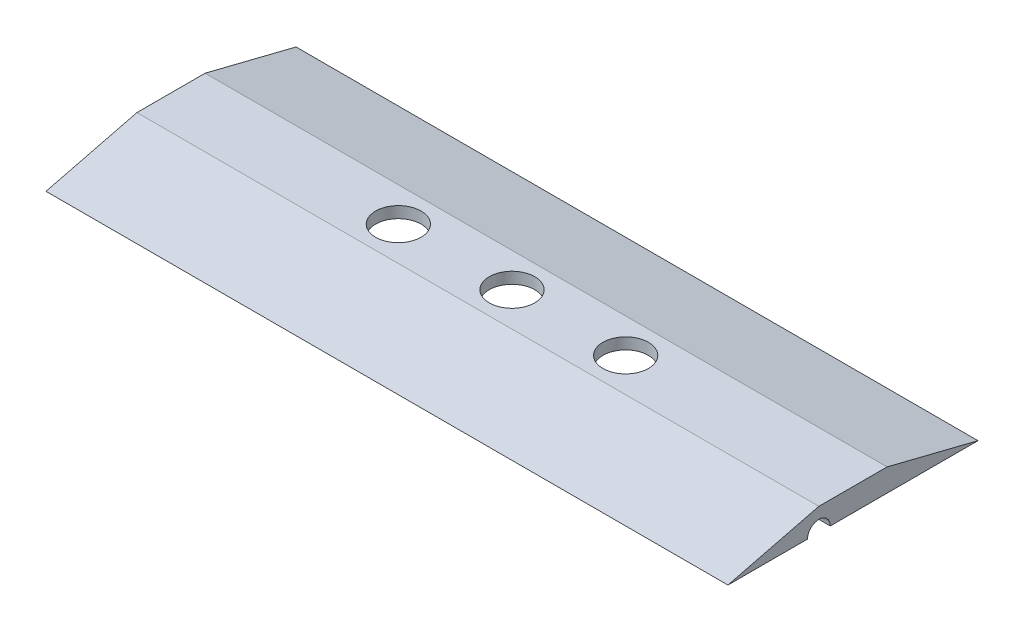
ISO-10303-21;
HEADER;
FILE_DESCRIPTION(('STEP AP214'),'2;1');
FILE_NAME('part.step','',(''),(''),'','','');
FILE_SCHEMA(('AUTOMOTIVE_DESIGN { 1 0 10303 214 1 1 1 1 }'));
ENDSEC;
DATA;
#1=APPLICATION_CONTEXT('core data for automotive mechanical design processes');
#2=APPLICATION_PROTOCOL_DEFINITION('international standard','automotive_design',2000,#1);
#3=PRODUCT_CONTEXT('',#1,'mechanical');
#4=PRODUCT('Part','Part','',(#3));
#5=PRODUCT_RELATED_PRODUCT_CATEGORY('part','',(#4));
#6=PRODUCT_DEFINITION_FORMATION('','',#4);
#7=PRODUCT_DEFINITION_CONTEXT('part definition',#1,'design');
#8=PRODUCT_DEFINITION('design','',#6,#7);
#9=PRODUCT_DEFINITION_SHAPE('','',#8);
#10=(LENGTH_UNIT() NAMED_UNIT(*) SI_UNIT(.MILLI.,.METRE.));
#11=(NAMED_UNIT(*) PLANE_ANGLE_UNIT() SI_UNIT($,.RADIAN.));
#12=(NAMED_UNIT(*) SI_UNIT($,.STERADIAN.) SOLID_ANGLE_UNIT());
#13=UNCERTAINTY_MEASURE_WITH_UNIT(LENGTH_MEASURE(1.E-05),#10,'distance_accuracy_value','');
#14=(GEOMETRIC_REPRESENTATION_CONTEXT(3) GLOBAL_UNCERTAINTY_ASSIGNED_CONTEXT((#13)) GLOBAL_UNIT_ASSIGNED_CONTEXT((#10,
#11,#12)) REPRESENTATION_CONTEXT('',''));
#15=CARTESIAN_POINT('',(0.,0.,0.));
#16=DIRECTION('',(0.,0.,1.));
#17=DIRECTION('',(1.,0.,0.));
#18=AXIS2_PLACEMENT_3D('',#15,#16,#17);
#19=CARTESIAN_POINT('',(0.,0.,0.));
#20=DIRECTION('',(0.,1.,0.));
#21=DIRECTION('',(0.,0.,1.));
#22=AXIS2_PLACEMENT_3D('',#19,#20,#21);
#23=CYLINDRICAL_SURFACE('',#22,10.);
#24=CARTESIAN_POINT('',(0.,10.,0.));
#25=DIRECTION('',(0.,1.,0.));
#26=DIRECTION('',(0.,0.,1.));
#27=AXIS2_PLACEMENT_3D('',#24,#25,#26);
#28=CIRCLE('',#27,10.);
#29=CARTESIAN_POINT('',(0.,10.,10.));
#30=VERTEX_POINT('',#29);
#31=EDGE_CURVE('E177',#30,#30,#28,.T.);
#32=ORIENTED_EDGE('',*,*,#31,.T.);
#33=EDGE_LOOP('',(#32));
#34=FACE_BOUND('',#33,.T.);
#35=CARTESIAN_POINT('',(0.,5.,0.));
#36=DIRECTION('',(0.,-1.,0.));
#37=DIRECTION('',(0.,0.,-1.));
#38=AXIS2_PLACEMENT_3D('',#35,#36,#37);
#39=CIRCLE('',#38,10.);
#40=CARTESIAN_POINT('',(0.,5.,-10.));
#41=VERTEX_POINT('',#40);
#42=EDGE_CURVE('E168',#41,#41,#39,.F.);
#43=ORIENTED_EDGE('',*,*,#42,.F.);
#44=EDGE_LOOP('',(#43));
#45=FACE_BOUND('',#44,.T.);
#46=ADVANCED_FACE('F41',(#34,#45),#23,.F.);
#47=CARTESIAN_POINT('',(50.,0.,0.));
#48=DIRECTION('',(0.,1.,0.));
#49=DIRECTION('',(0.,0.,1.));
#50=AXIS2_PLACEMENT_3D('',#47,#48,#49);
#51=CYLINDRICAL_SURFACE('',#50,10.);
#52=CARTESIAN_POINT('',(50.,10.,0.));
#53=DIRECTION('',(0.,1.,0.));
#54=DIRECTION('',(0.,0.,1.));
#55=AXIS2_PLACEMENT_3D('',#52,#53,#54);
#56=CIRCLE('',#55,10.);
#57=CARTESIAN_POINT('',(50.,10.,10.));
#58=VERTEX_POINT('',#57);
#59=EDGE_CURVE('E173',#58,#58,#56,.T.);
#60=ORIENTED_EDGE('',*,*,#59,.T.);
#61=EDGE_LOOP('',(#60));
#62=FACE_BOUND('',#61,.T.);
#63=CARTESIAN_POINT('',(50.,5.,0.));
#64=DIRECTION('',(0.,-1.,0.));
#65=DIRECTION('',(0.,0.,-1.));
#66=AXIS2_PLACEMENT_3D('',#63,#64,#65);
#67=CIRCLE('',#66,10.);
#68=CARTESIAN_POINT('',(50.,5.,-10.));
#69=VERTEX_POINT('',#68);
#70=EDGE_CURVE('E164',#69,#69,#67,.F.);
#71=ORIENTED_EDGE('',*,*,#70,.F.);
#72=EDGE_LOOP('',(#71));
#73=FACE_BOUND('',#72,.T.);
#74=ADVANCED_FACE('F294',(#62,#73),#51,.F.);
#75=CARTESIAN_POINT('',(-50.,0.,0.));
#76=DIRECTION('',(0.,1.,0.));
#77=DIRECTION('',(0.,0.,1.));
#78=AXIS2_PLACEMENT_3D('',#75,#76,#77);
#79=CYLINDRICAL_SURFACE('',#78,10.);
#80=CARTESIAN_POINT('',(-50.,10.,0.));
#81=DIRECTION('',(0.,1.,0.));
#82=DIRECTION('',(0.,0.,-1.));
#83=AXIS2_PLACEMENT_3D('',#80,#81,#82);
#84=CIRCLE('',#83,10.);
#85=CARTESIAN_POINT('',(-50.,10.,-10.));
#86=VERTEX_POINT('',#85);
#87=EDGE_CURVE('E172',#86,#86,#84,.T.);
#88=ORIENTED_EDGE('',*,*,#87,.T.);
#89=EDGE_LOOP('',(#88));
#90=FACE_BOUND('',#89,.T.);
#91=CARTESIAN_POINT('',(-50.,5.,0.));
#92=DIRECTION('',(0.,-1.,0.));
#93=DIRECTION('',(0.,0.,-1.));
#94=AXIS2_PLACEMENT_3D('',#91,#92,#93);
#95=CIRCLE('',#94,10.);
#96=CARTESIAN_POINT('',(-50.,5.,-10.));
#97=VERTEX_POINT('',#96);
#98=EDGE_CURVE('E162',#97,#97,#95,.F.);
#99=ORIENTED_EDGE('',*,*,#98,.F.);
#100=EDGE_LOOP('',(#99));
#101=FACE_BOUND('',#100,.T.);
#102=ADVANCED_FACE('F291',(#90,#101),#79,.F.);
#103=CARTESIAN_POINT('',(150.,0.,-15.));
#104=DIRECTION('',(0.,1.,0.));
#105=DIRECTION('',(0.,0.,1.));
#106=AXIS2_PLACEMENT_3D('',#103,#104,#105);
#107=PLANE('',#106);
#108=DIRECTION('',(1.,0.,0.));
#109=VECTOR('',#108,1.);
#110=CARTESIAN_POINT('',(-75.,0.,-15.));
#111=LINE('',#110,#109);
#112=CARTESIAN_POINT('',(-75.,0.,-15.));
#113=VERTEX_POINT('',#112);
#114=CARTESIAN_POINT('',(75.,0.,-15.));
#115=VERTEX_POINT('',#114);
#116=EDGE_CURVE('E146',#113,#115,#111,.T.);
#117=ORIENTED_EDGE('',*,*,#116,.F.);
#118=DIRECTION('',(0.,0.,-1.));
#119=VECTOR('',#118,1.);
#120=CARTESIAN_POINT('',(-75.,0.,15.));
#121=LINE('',#120,#119);
#122=CARTESIAN_POINT('',(-75.,0.,10.));
#123=VERTEX_POINT('',#122);
#124=EDGE_CURVE('E127',#123,#113,#121,.T.);
#125=ORIENTED_EDGE('',*,*,#124,.F.);
#126=DIRECTION('',(-1.,0.,0.));
#127=VECTOR('',#126,1.);
#128=CARTESIAN_POINT('',(150.,0.,10.));
#129=LINE('',#128,#127);
#130=CARTESIAN_POINT('',(-150.,0.,10.));
#131=VERTEX_POINT('',#130);
#132=EDGE_CURVE('E193',#123,#131,#129,.T.);
#133=ORIENTED_EDGE('',*,*,#132,.T.);
#134=DIRECTION('',(0.,0.,-1.));
#135=VECTOR('',#134,1.);
#136=CARTESIAN_POINT('',(-150.,0.,-15.));
#137=LINE('',#136,#135);
#138=CARTESIAN_POINT('',(-150.,0.,-55.));
#139=VERTEX_POINT('',#138);
#140=EDGE_CURVE('E219',#131,#139,#137,.T.);
#141=ORIENTED_EDGE('',*,*,#140,.T.);
#142=DIRECTION('',(-1.,0.,0.));
#143=VECTOR('',#142,1.);
#144=CARTESIAN_POINT('',(150.,0.,-55.));
#145=LINE('',#144,#143);
#146=CARTESIAN_POINT('',(150.,0.,-55.));
#147=VERTEX_POINT('',#146);
#148=EDGE_CURVE('E236',#147,#139,#145,.T.);
#149=ORIENTED_EDGE('',*,*,#148,.F.);
#150=DIRECTION('',(0.,0.,-1.));
#151=VECTOR('',#150,1.);
#152=CARTESIAN_POINT('',(150.,0.,15.));
#153=LINE('',#152,#151);
#154=CARTESIAN_POINT('',(150.,0.,10.));
#155=VERTEX_POINT('',#154);
#156=EDGE_CURVE('E203',#155,#147,#153,.T.);
#157=ORIENTED_EDGE('',*,*,#156,.F.);
#158=CARTESIAN_POINT('',(75.,0.,10.));
#159=VERTEX_POINT('',#158);
#160=EDGE_CURVE('E194',#155,#159,#129,.T.);
#161=ORIENTED_EDGE('',*,*,#160,.T.);
#162=DIRECTION('',(0.,0.,1.));
#163=VECTOR('',#162,1.);
#164=CARTESIAN_POINT('',(75.,0.,15.));
#165=LINE('',#164,#163);
#166=EDGE_CURVE('E143',#115,#159,#165,.T.);
#167=ORIENTED_EDGE('',*,*,#166,.F.);
#168=EDGE_LOOP('',(#117,#125,#133,#141,#149,#157,#161,#167));
#169=FACE_BOUND('',#168,.T.);
#170=ADVANCED_FACE('F254',(#169),#107,.F.);
#171=CARTESIAN_POINT('',(150.,0.,55.));
#172=DIRECTION('',(0.,-0.970142500145332,-0.242535625036333));
#173=DIRECTION('',(0.,0.242535625036333,-0.970142500145332));
#174=AXIS2_PLACEMENT_3D('',#171,#172,#173);
#175=PLANE('',#174);
#176=DIRECTION('',(0.,-0.242535625036333,0.970142500145332));
#177=VECTOR('',#176,1.);
#178=CARTESIAN_POINT('',(-150.,0.,55.));
#179=LINE('',#178,#177);
#180=CARTESIAN_POINT('',(-150.,10.,15.));
#181=VERTEX_POINT('',#180);
#182=CARTESIAN_POINT('',(-150.,0.,55.));
#183=VERTEX_POINT('',#182);
#184=EDGE_CURVE('E198',#181,#183,#179,.T.);
#185=ORIENTED_EDGE('',*,*,#184,.T.);
#186=DIRECTION('',(-1.,0.,0.));
#187=VECTOR('',#186,1.);
#188=CARTESIAN_POINT('',(150.,0.,55.));
#189=LINE('',#188,#187);
#190=CARTESIAN_POINT('',(150.,0.,55.));
#191=VERTEX_POINT('',#190);
#192=EDGE_CURVE('E240',#191,#183,#189,.T.);
#193=ORIENTED_EDGE('',*,*,#192,.F.);
#194=DIRECTION('',(0.,-0.242535625036333,0.970142500145332));
#195=VECTOR('',#194,1.);
#196=CARTESIAN_POINT('',(150.,0.,55.));
#197=LINE('',#196,#195);
#198=CARTESIAN_POINT('',(150.,10.,15.));
#199=VERTEX_POINT('',#198);
#200=EDGE_CURVE('E199',#199,#191,#197,.T.);
#201=ORIENTED_EDGE('',*,*,#200,.F.);
#202=DIRECTION('',(-1.,0.,0.));
#203=VECTOR('',#202,1.);
#204=CARTESIAN_POINT('',(150.,10.,15.));
#205=LINE('',#204,#203);
#206=EDGE_CURVE('E215',#199,#181,#205,.T.);
#207=ORIENTED_EDGE('',*,*,#206,.T.);
#208=EDGE_LOOP('',(#185,#193,#201,#207));
#209=FACE_BOUND('',#208,.T.);
#210=ADVANCED_FACE('F43',(#209),#175,.F.);
#211=CARTESIAN_POINT('',(-150.,0.,20.));
#212=VERTEX_POINT('',#211);
#213=EDGE_CURVE('E220',#183,#212,#137,.T.);
#214=ORIENTED_EDGE('',*,*,#213,.T.);
#215=DIRECTION('',(-1.,0.,0.));
#216=VECTOR('',#215,1.);
#217=CARTESIAN_POINT('',(150.,0.,20.));
#218=LINE('',#217,#216);
#219=CARTESIAN_POINT('',(150.,0.,20.));
#220=VERTEX_POINT('',#219);
#221=EDGE_CURVE('E65',#212,#220,#218,.F.);
#222=ORIENTED_EDGE('',*,*,#221,.T.);
#223=EDGE_CURVE('E205',#191,#220,#153,.T.);
#224=ORIENTED_EDGE('',*,*,#223,.F.);
#225=ORIENTED_EDGE('',*,*,#192,.T.);
#226=EDGE_LOOP('',(#214,#222,#224,#225));
#227=FACE_BOUND('',#226,.T.);
#228=ADVANCED_FACE('F279',(#227),#107,.F.);
#229=CARTESIAN_POINT('',(150.,0.,-55.));
#230=DIRECTION('',(0.,-0.970142500145332,0.242535625036333));
#231=DIRECTION('',(0.,-0.242535625036333,-0.970142500145332));
#232=AXIS2_PLACEMENT_3D('',#229,#230,#231);
#233=PLANE('',#232);
#234=DIRECTION('',(0.,0.242535625036333,0.970142500145332));
#235=VECTOR('',#234,1.);
#236=CARTESIAN_POINT('',(-150.,0.,-55.));
#237=LINE('',#236,#235);
#238=CARTESIAN_POINT('',(-150.,10.,-15.));
#239=VERTEX_POINT('',#238);
#240=EDGE_CURVE('E224',#139,#239,#237,.T.);
#241=ORIENTED_EDGE('',*,*,#240,.T.);
#242=DIRECTION('',(-1.,0.,0.));
#243=VECTOR('',#242,1.);
#244=CARTESIAN_POINT('',(150.,10.,-15.));
#245=LINE('',#244,#243);
#246=CARTESIAN_POINT('',(150.,10.,-15.));
#247=VERTEX_POINT('',#246);
#248=EDGE_CURVE('E232',#247,#239,#245,.T.);
#249=ORIENTED_EDGE('',*,*,#248,.F.);
#250=DIRECTION('',(0.,0.242535625036333,0.970142500145332));
#251=VECTOR('',#250,1.);
#252=CARTESIAN_POINT('',(150.,0.,-55.));
#253=LINE('',#252,#251);
#254=EDGE_CURVE('E209',#147,#247,#253,.T.);
#255=ORIENTED_EDGE('',*,*,#254,.F.);
#256=ORIENTED_EDGE('',*,*,#148,.T.);
#257=EDGE_LOOP('',(#241,#249,#255,#256));
#258=FACE_BOUND('',#257,.T.);
#259=ADVANCED_FACE('F269',(#258),#233,.F.);
#260=CARTESIAN_POINT('',(150.,10.,15.));
#261=DIRECTION('',(0.,-1.,0.));
#262=DIRECTION('',(0.,0.,-1.));
#263=AXIS2_PLACEMENT_3D('',#260,#261,#262);
#264=PLANE('',#263);
#265=ORIENTED_EDGE('',*,*,#87,.F.);
#266=EDGE_LOOP('',(#265));
#267=FACE_BOUND('',#266,.T.);
#268=ORIENTED_EDGE('',*,*,#59,.F.);
#269=EDGE_LOOP('',(#268));
#270=FACE_BOUND('',#269,.T.);
#271=ORIENTED_EDGE('',*,*,#31,.F.);
#272=EDGE_LOOP('',(#271));
#273=FACE_BOUND('',#272,.T.);
#274=DIRECTION('',(0.,0.,1.));
#275=VECTOR('',#274,1.);
#276=CARTESIAN_POINT('',(-150.,10.,15.));
#277=LINE('',#276,#275);
#278=EDGE_CURVE('E204',#239,#181,#277,.T.);
#279=ORIENTED_EDGE('',*,*,#278,.T.);
#280=ORIENTED_EDGE('',*,*,#206,.F.);
#281=DIRECTION('',(0.,0.,1.));
#282=VECTOR('',#281,1.);
#283=CARTESIAN_POINT('',(150.,10.,15.));
#284=LINE('',#283,#282);
#285=EDGE_CURVE('E212',#247,#199,#284,.T.);
#286=ORIENTED_EDGE('',*,*,#285,.F.);
#287=ORIENTED_EDGE('',*,*,#248,.T.);
#288=EDGE_LOOP('',(#279,#280,#286,#287));
#289=FACE_BOUND('',#288,.T.);
#290=ADVANCED_FACE('F272',(#267,#270,#273,#289),#264,.F.);
#291=CARTESIAN_POINT('',(150.,0.,0.));
#292=DIRECTION('',(1.,0.,0.));
#293=DIRECTION('',(0.,0.,-1.));
#294=AXIS2_PLACEMENT_3D('',#291,#292,#293);
#295=PLANE('',#294);
#296=CARTESIAN_POINT('',(150.,0.,15.));
#297=DIRECTION('',(-1.,0.,0.));
#298=DIRECTION('',(0.,0.,1.));
#299=AXIS2_PLACEMENT_3D('',#296,#297,#298);
#300=CIRCLE('',#299,5.);
#301=EDGE_CURVE('E185',#220,#155,#300,.T.);
#302=ORIENTED_EDGE('',*,*,#301,.T.);
#303=ORIENTED_EDGE('',*,*,#156,.T.);
#304=ORIENTED_EDGE('',*,*,#254,.T.);
#305=ORIENTED_EDGE('',*,*,#285,.T.);
#306=ORIENTED_EDGE('',*,*,#200,.T.);
#307=ORIENTED_EDGE('',*,*,#223,.T.);
#308=EDGE_LOOP('',(#302,#303,#304,#305,#306,#307));
#309=FACE_BOUND('',#308,.T.);
#310=ADVANCED_FACE('F275',(#309),#295,.T.);
#311=CARTESIAN_POINT('',(-150.,0.,0.));
#312=DIRECTION('',(1.,0.,0.));
#313=DIRECTION('',(0.,0.,-1.));
#314=AXIS2_PLACEMENT_3D('',#311,#312,#313);
#315=PLANE('',#314);
#316=ORIENTED_EDGE('',*,*,#140,.F.);
#317=CARTESIAN_POINT('',(-150.,0.,15.));
#318=DIRECTION('',(-1.,0.,0.));
#319=DIRECTION('',(0.,0.,1.));
#320=AXIS2_PLACEMENT_3D('',#317,#318,#319);
#321=CIRCLE('',#320,5.);
#322=EDGE_CURVE('E184',#212,#131,#321,.T.);
#323=ORIENTED_EDGE('',*,*,#322,.F.);
#324=ORIENTED_EDGE('',*,*,#213,.F.);
#325=ORIENTED_EDGE('',*,*,#184,.F.);
#326=ORIENTED_EDGE('',*,*,#278,.F.);
#327=ORIENTED_EDGE('',*,*,#240,.F.);
#328=EDGE_LOOP('',(#316,#323,#324,#325,#326,#327));
#329=FACE_BOUND('',#328,.T.);
#330=ADVANCED_FACE('F264',(#329),#315,.F.);
#331=CARTESIAN_POINT('',(150.,0.,15.));
#332=DIRECTION('',(-1.,0.,0.));
#333=DIRECTION('',(0.,0.,1.));
#334=AXIS2_PLACEMENT_3D('',#331,#332,#333);
#335=CYLINDRICAL_SURFACE('',#334,5.);
#336=ORIENTED_EDGE('',*,*,#132,.F.);
#337=CARTESIAN_POINT('',(-75.,0.,15.));
#338=DIRECTION('',(-1.,0.,0.));
#339=DIRECTION('',(0.,0.,1.));
#340=AXIS2_PLACEMENT_3D('',#337,#338,#339);
#341=CIRCLE('',#340,5.);
#342=CARTESIAN_POINT('',(-75.,5.,15.));
#343=VERTEX_POINT('',#342);
#344=EDGE_CURVE('E11',#123,#343,#341,.F.);
#345=ORIENTED_EDGE('',*,*,#344,.T.);
#346=DIRECTION('',(-1.,0.,0.));
#347=VECTOR('',#346,1.);
#348=CARTESIAN_POINT('',(-75.,5.,15.));
#349=LINE('',#348,#347);
#350=CARTESIAN_POINT('',(75.,5.00000000000001,15.));
#351=VERTEX_POINT('',#350);
#352=EDGE_CURVE('E133',#351,#343,#349,.T.);
#353=ORIENTED_EDGE('',*,*,#352,.F.);
#354=CARTESIAN_POINT('',(75.,0.,15.));
#355=DIRECTION('',(1.,0.,0.));
#356=DIRECTION('',(0.,0.,-1.));
#357=AXIS2_PLACEMENT_3D('',#354,#355,#356);
#358=CIRCLE('',#357,5.);
#359=EDGE_CURVE('E50',#351,#159,#358,.F.);
#360=ORIENTED_EDGE('',*,*,#359,.T.);
#361=ORIENTED_EDGE('',*,*,#160,.F.);
#362=ORIENTED_EDGE('',*,*,#301,.F.);
#363=ORIENTED_EDGE('',*,*,#221,.F.);
#364=ORIENTED_EDGE('',*,*,#322,.T.);
#365=EDGE_LOOP('',(#336,#345,#353,#360,#361,#362,#363,#364));
#366=FACE_BOUND('',#365,.T.);
#367=ADVANCED_FACE('F249',(#366),#335,.F.);
#368=CARTESIAN_POINT('',(-75.,5.,15.));
#369=DIRECTION('',(-1.,0.,0.));
#370=DIRECTION('',(0.,0.,1.));
#371=AXIS2_PLACEMENT_3D('',#368,#369,#370);
#372=PLANE('',#371);
#373=ORIENTED_EDGE('',*,*,#124,.T.);
#374=DIRECTION('',(0.,-1.,0.));
#375=VECTOR('',#374,1.);
#376=CARTESIAN_POINT('',(-75.,5.,-15.));
#377=LINE('',#376,#375);
#378=CARTESIAN_POINT('',(-75.,5.,-15.));
#379=VERTEX_POINT('',#378);
#380=EDGE_CURVE('E121',#379,#113,#377,.T.);
#381=ORIENTED_EDGE('',*,*,#380,.F.);
#382=DIRECTION('',(0.,0.,-1.));
#383=VECTOR('',#382,1.);
#384=CARTESIAN_POINT('',(-75.,5.,15.));
#385=LINE('',#384,#383);
#386=EDGE_CURVE('E125',#343,#379,#385,.T.);
#387=ORIENTED_EDGE('',*,*,#386,.F.);
#388=ORIENTED_EDGE('',*,*,#344,.F.);
#389=EDGE_LOOP('',(#373,#381,#387,#388));
#390=FACE_BOUND('',#389,.T.);
#391=ADVANCED_FACE('F123',(#390),#372,.F.);
#392=CARTESIAN_POINT('',(75.,5.,15.));
#393=DIRECTION('',(1.,0.,0.));
#394=DIRECTION('',(0.,0.,-1.));
#395=AXIS2_PLACEMENT_3D('',#392,#393,#394);
#396=PLANE('',#395);
#397=DIRECTION('',(0.,0.,1.));
#398=VECTOR('',#397,1.);
#399=CARTESIAN_POINT('',(75.,5.,15.));
#400=LINE('',#399,#398);
#401=CARTESIAN_POINT('',(75.,5.,-15.));
#402=VERTEX_POINT('',#401);
#403=EDGE_CURVE('E57',#402,#351,#400,.T.);
#404=ORIENTED_EDGE('',*,*,#403,.F.);
#405=DIRECTION('',(0.,-1.,0.));
#406=VECTOR('',#405,1.);
#407=CARTESIAN_POINT('',(75.,5.,-15.));
#408=LINE('',#407,#406);
#409=EDGE_CURVE('E132',#402,#115,#408,.T.);
#410=ORIENTED_EDGE('',*,*,#409,.T.);
#411=ORIENTED_EDGE('',*,*,#166,.T.);
#412=ORIENTED_EDGE('',*,*,#359,.F.);
#413=EDGE_LOOP('',(#404,#410,#411,#412));
#414=FACE_BOUND('',#413,.T.);
#415=ADVANCED_FACE('F325',(#414),#396,.F.);
#416=CARTESIAN_POINT('',(0.,5.,0.));
#417=DIRECTION('',(0.,-1.,0.));
#418=DIRECTION('',(0.,0.,-1.));
#419=AXIS2_PLACEMENT_3D('',#416,#417,#418);
#420=PLANE('',#419);
#421=CARTESIAN_POINT('',(68.5756915975451,5.,5.79234125783524E-13));
#422=DIRECTION('',(0.,-1.,0.));
#423=DIRECTION('',(0.,0.,-1.));
#424=AXIS2_PLACEMENT_3D('',#421,#422,#423);
#425=CIRCLE('',#424,2.50000000000001);
#426=CARTESIAN_POINT('',(68.5756915975451,5.,-2.49999999999943));
#427=VERTEX_POINT('',#426);
#428=EDGE_CURVE('E531',#427,#427,#425,.T.);
#429=ORIENTED_EDGE('',*,*,#428,.F.);
#430=EDGE_LOOP('',(#429));
#431=FACE_BOUND('',#430,.T.);
#432=CARTESIAN_POINT('',(33.5756915975451,5.,0.));
#433=DIRECTION('',(0.,-1.,0.));
#434=DIRECTION('',(0.,0.,-1.));
#435=AXIS2_PLACEMENT_3D('',#432,#433,#434);
#436=CIRCLE('',#435,2.50000000000001);
#437=CARTESIAN_POINT('',(33.5756915975451,5.,-2.50000000000001));
#438=VERTEX_POINT('',#437);
#439=EDGE_CURVE('E523',#438,#438,#436,.T.);
#440=ORIENTED_EDGE('',*,*,#439,.F.);
#441=EDGE_LOOP('',(#440));
#442=FACE_BOUND('',#441,.T.);
#443=CARTESIAN_POINT('',(18.5756915975451,5.,5.79234125783524E-13));
#444=DIRECTION('',(0.,-1.,0.));
#445=DIRECTION('',(0.,0.,-1.));
#446=AXIS2_PLACEMENT_3D('',#443,#444,#445);
#447=CIRCLE('',#446,2.50000000000001);
#448=CARTESIAN_POINT('',(18.5756915975451,5.,-2.49999999999943));
#449=VERTEX_POINT('',#448);
#450=EDGE_CURVE('E517',#449,#449,#447,.T.);
#451=ORIENTED_EDGE('',*,*,#450,.F.);
#452=EDGE_LOOP('',(#451));
#453=FACE_BOUND('',#452,.T.);
#454=CARTESIAN_POINT('',(-16.4243084024549,5.,0.));
#455=DIRECTION('',(0.,-1.,0.));
#456=DIRECTION('',(0.,0.,-1.));
#457=AXIS2_PLACEMENT_3D('',#454,#455,#456);
#458=CIRCLE('',#457,2.50000000000001);
#459=CARTESIAN_POINT('',(-16.4243084024549,5.,-2.50000000000001));
#460=VERTEX_POINT('',#459);
#461=EDGE_CURVE('E497',#460,#460,#458,.T.);
#462=ORIENTED_EDGE('',*,*,#461,.F.);
#463=EDGE_LOOP('',(#462));
#464=FACE_BOUND('',#463,.T.);
#465=CARTESIAN_POINT('',(-31.4243084024549,5.,5.79234125783524E-13));
#466=DIRECTION('',(0.,-1.,0.));
#467=DIRECTION('',(0.,0.,-1.));
#468=AXIS2_PLACEMENT_3D('',#465,#466,#467);
#469=CIRCLE('',#468,2.50000000000001);
#470=CARTESIAN_POINT('',(-31.4243084024549,5.,-2.49999999999943));
#471=VERTEX_POINT('',#470);
#472=EDGE_CURVE('E496',#471,#471,#469,.T.);
#473=ORIENTED_EDGE('',*,*,#472,.F.);
#474=EDGE_LOOP('',(#473));
#475=FACE_BOUND('',#474,.T.);
#476=CARTESIAN_POINT('',(-66.4243084024549,5.,0.));
#477=DIRECTION('',(0.,-1.,0.));
#478=DIRECTION('',(0.,0.,-1.));
#479=AXIS2_PLACEMENT_3D('',#476,#477,#478);
#480=CIRCLE('',#479,2.50000000000001);
#481=CARTESIAN_POINT('',(-66.4243084024549,5.,-2.50000000000001));
#482=VERTEX_POINT('',#481);
#483=EDGE_CURVE('E158',#482,#482,#480,.T.);
#484=ORIENTED_EDGE('',*,*,#483,.F.);
#485=EDGE_LOOP('',(#484));
#486=FACE_BOUND('',#485,.T.);
#487=ORIENTED_EDGE('',*,*,#386,.T.);
#488=DIRECTION('',(1.,0.,0.));
#489=VECTOR('',#488,1.);
#490=CARTESIAN_POINT('',(-75.,5.,-15.));
#491=LINE('',#490,#489);
#492=EDGE_CURVE('E135',#379,#402,#491,.T.);
#493=ORIENTED_EDGE('',*,*,#492,.T.);
#494=ORIENTED_EDGE('',*,*,#403,.T.);
#495=ORIENTED_EDGE('',*,*,#352,.T.);
#496=EDGE_LOOP('',(#487,#493,#494,#495));
#497=FACE_BOUND('',#496,.T.);
#498=ORIENTED_EDGE('',*,*,#98,.T.);
#499=EDGE_LOOP('',(#498));
#500=FACE_BOUND('',#499,.T.);
#501=ORIENTED_EDGE('',*,*,#70,.T.);
#502=EDGE_LOOP('',(#501));
#503=FACE_BOUND('',#502,.T.);
#504=ORIENTED_EDGE('',*,*,#42,.T.);
#505=EDGE_LOOP('',(#504));
#506=FACE_BOUND('',#505,.T.);
#507=ADVANCED_FACE('F139',(#431,#442,#453,#464,#475,#486,#497,#500,#503,#506),#420,.T.);
#508=CARTESIAN_POINT('',(-75.,5.,-15.));
#509=DIRECTION('',(0.,0.,-1.));
#510=DIRECTION('',(0.,1.,0.));
#511=AXIS2_PLACEMENT_3D('',#508,#509,#510);
#512=PLANE('',#511);
#513=ORIENTED_EDGE('',*,*,#116,.T.);
#514=ORIENTED_EDGE('',*,*,#409,.F.);
#515=ORIENTED_EDGE('',*,*,#492,.F.);
#516=ORIENTED_EDGE('',*,*,#380,.T.);
#517=EDGE_LOOP('',(#513,#514,#515,#516));
#518=FACE_BOUND('',#517,.T.);
#519=ADVANCED_FACE('F136',(#518),#512,.F.);
#520=CARTESIAN_POINT('',(-66.4243084024549,5.,0.));
#521=DIRECTION('',(0.,-1.,0.));
#522=DIRECTION('',(0.,0.,-1.));
#523=AXIS2_PLACEMENT_3D('',#520,#521,#522);
#524=CYLINDRICAL_SURFACE('',#523,2.50000000000001);
#525=ORIENTED_EDGE('',*,*,#483,.T.);
#526=EDGE_LOOP('',(#525));
#527=FACE_BOUND('',#526,.T.);
#528=CARTESIAN_POINT('',(-66.4243084024549,0.,0.));
#529=DIRECTION('',(0.,-1.,0.));
#530=DIRECTION('',(0.,0.,-1.));
#531=AXIS2_PLACEMENT_3D('',#528,#529,#530);
#532=CIRCLE('',#531,2.50000000000001);
#533=CARTESIAN_POINT('',(-66.4243084024549,0.,-2.50000000000001));
#534=VERTEX_POINT('',#533);
#535=EDGE_CURVE('E149',#534,#534,#532,.T.);
#536=ORIENTED_EDGE('',*,*,#535,.F.);
#537=EDGE_LOOP('',(#536));
#538=FACE_BOUND('',#537,.T.);
#539=ADVANCED_FACE('F333',(#527,#538),#524,.T.);
#540=CARTESIAN_POINT('',(-31.4243084024549,5.,5.79234125783524E-13));
#541=DIRECTION('',(0.,-1.,0.));
#542=DIRECTION('',(0.,0.,-1.));
#543=AXIS2_PLACEMENT_3D('',#540,#541,#542);
#544=CYLINDRICAL_SURFACE('',#543,2.50000000000001);
#545=ORIENTED_EDGE('',*,*,#472,.T.);
#546=EDGE_LOOP('',(#545));
#547=FACE_BOUND('',#546,.T.);
#548=CARTESIAN_POINT('',(-31.4243084024549,0.,5.79922989608044E-13));
#549=DIRECTION('',(0.,-1.,0.));
#550=DIRECTION('',(0.,0.,-1.));
#551=AXIS2_PLACEMENT_3D('',#548,#549,#550);
#552=CIRCLE('',#551,2.50000000000001);
#553=CARTESIAN_POINT('',(-31.4243084024549,0.,-2.49999999999943));
#554=VERTEX_POINT('',#553);
#555=EDGE_CURVE('E493',#554,#554,#552,.T.);
#556=ORIENTED_EDGE('',*,*,#555,.F.);
#557=EDGE_LOOP('',(#556));
#558=FACE_BOUND('',#557,.T.);
#559=ADVANCED_FACE('F369',(#547,#558),#544,.T.);
#560=CARTESIAN_POINT('',(-16.4243084024549,5.,0.));
#561=DIRECTION('',(0.,-1.,0.));
#562=DIRECTION('',(0.,0.,-1.));
#563=AXIS2_PLACEMENT_3D('',#560,#561,#562);
#564=CYLINDRICAL_SURFACE('',#563,2.50000000000001);
#565=ORIENTED_EDGE('',*,*,#461,.T.);
#566=EDGE_LOOP('',(#565));
#567=FACE_BOUND('',#566,.T.);
#568=CARTESIAN_POINT('',(-16.4243084024549,0.,0.));
#569=DIRECTION('',(0.,-1.,0.));
#570=DIRECTION('',(0.,0.,-1.));
#571=AXIS2_PLACEMENT_3D('',#568,#569,#570);
#572=CIRCLE('',#571,2.50000000000001);
#573=CARTESIAN_POINT('',(-16.4243084024549,0.,-2.50000000000001));
#574=VERTEX_POINT('',#573);
#575=EDGE_CURVE('E504',#574,#574,#572,.T.);
#576=ORIENTED_EDGE('',*,*,#575,.F.);
#577=EDGE_LOOP('',(#576));
#578=FACE_BOUND('',#577,.T.);
#579=ADVANCED_FACE('F378',(#567,#578),#564,.T.);
#580=CARTESIAN_POINT('',(18.5756915975451,5.,5.79234125783524E-13));
#581=DIRECTION('',(0.,-1.,0.));
#582=DIRECTION('',(0.,0.,-1.));
#583=AXIS2_PLACEMENT_3D('',#580,#581,#582);
#584=CYLINDRICAL_SURFACE('',#583,2.50000000000001);
#585=ORIENTED_EDGE('',*,*,#450,.T.);
#586=EDGE_LOOP('',(#585));
#587=FACE_BOUND('',#586,.T.);
#588=CARTESIAN_POINT('',(18.5756915975451,0.,5.79922989608044E-13));
#589=DIRECTION('',(0.,-1.,0.));
#590=DIRECTION('',(0.,0.,-1.));
#591=AXIS2_PLACEMENT_3D('',#588,#589,#590);
#592=CIRCLE('',#591,2.50000000000001);
#593=CARTESIAN_POINT('',(18.5756915975451,0.,-2.49999999999943));
#594=VERTEX_POINT('',#593);
#595=EDGE_CURVE('E519',#594,#594,#592,.T.);
#596=ORIENTED_EDGE('',*,*,#595,.F.);
#597=EDGE_LOOP('',(#596));
#598=FACE_BOUND('',#597,.T.);
#599=ADVANCED_FACE('F387',(#587,#598),#584,.T.);
#600=CARTESIAN_POINT('',(33.5756915975451,5.,0.));
#601=DIRECTION('',(0.,-1.,0.));
#602=DIRECTION('',(0.,0.,-1.));
#603=AXIS2_PLACEMENT_3D('',#600,#601,#602);
#604=CYLINDRICAL_SURFACE('',#603,2.50000000000001);
#605=ORIENTED_EDGE('',*,*,#439,.T.);
#606=EDGE_LOOP('',(#605));
#607=FACE_BOUND('',#606,.T.);
#608=CARTESIAN_POINT('',(33.5756915975451,0.,0.));
#609=DIRECTION('',(0.,-1.,0.));
#610=DIRECTION('',(0.,0.,-1.));
#611=AXIS2_PLACEMENT_3D('',#608,#609,#610);
#612=CIRCLE('',#611,2.50000000000001);
#613=CARTESIAN_POINT('',(33.5756915975451,0.,-2.50000000000001));
#614=VERTEX_POINT('',#613);
#615=EDGE_CURVE('E527',#614,#614,#612,.T.);
#616=ORIENTED_EDGE('',*,*,#615,.F.);
#617=EDGE_LOOP('',(#616));
#618=FACE_BOUND('',#617,.T.);
#619=ADVANCED_FACE('F397',(#607,#618),#604,.T.);
#620=CARTESIAN_POINT('',(68.5756915975451,5.,5.79234125783524E-13));
#621=DIRECTION('',(0.,-1.,0.));
#622=DIRECTION('',(0.,0.,-1.));
#623=AXIS2_PLACEMENT_3D('',#620,#621,#622);
#624=CYLINDRICAL_SURFACE('',#623,2.50000000000001);
#625=ORIENTED_EDGE('',*,*,#428,.T.);
#626=EDGE_LOOP('',(#625));
#627=FACE_BOUND('',#626,.T.);
#628=CARTESIAN_POINT('',(68.5756915975451,0.,5.79922989608044E-13));
#629=DIRECTION('',(0.,-1.,0.));
#630=DIRECTION('',(0.,0.,-1.));
#631=AXIS2_PLACEMENT_3D('',#628,#629,#630);
#632=CIRCLE('',#631,2.50000000000001);
#633=CARTESIAN_POINT('',(68.5756915975451,0.,-2.49999999999943));
#634=VERTEX_POINT('',#633);
#635=EDGE_CURVE('E535',#634,#634,#632,.T.);
#636=ORIENTED_EDGE('',*,*,#635,.F.);
#637=EDGE_LOOP('',(#636));
#638=FACE_BOUND('',#637,.T.);
#639=ADVANCED_FACE('F407',(#627,#638),#624,.T.);
#640=ORIENTED_EDGE('',*,*,#635,.T.);
#641=EDGE_LOOP('',(#640));
#642=FACE_BOUND('',#641,.T.);
#643=ADVANCED_FACE('F292',(#642),#107,.F.);
#644=ORIENTED_EDGE('',*,*,#615,.T.);
#645=EDGE_LOOP('',(#644));
#646=FACE_BOUND('',#645,.T.);
#647=ADVANCED_FACE('F426',(#646),#107,.F.);
#648=ORIENTED_EDGE('',*,*,#595,.T.);
#649=EDGE_LOOP('',(#648));
#650=FACE_BOUND('',#649,.T.);
#651=ADVANCED_FACE('F437',(#650),#107,.F.);
#652=ORIENTED_EDGE('',*,*,#575,.T.);
#653=EDGE_LOOP('',(#652));
#654=FACE_BOUND('',#653,.T.);
#655=ADVANCED_FACE('F448',(#654),#107,.F.);
#656=ORIENTED_EDGE('',*,*,#555,.T.);
#657=EDGE_LOOP('',(#656));
#658=FACE_BOUND('',#657,.T.);
#659=ADVANCED_FACE('F288',(#658),#107,.F.);
#660=ORIENTED_EDGE('',*,*,#535,.T.);
#661=EDGE_LOOP('',(#660));
#662=FACE_BOUND('',#661,.T.);
#663=ADVANCED_FACE('F281',(#662),#107,.F.);
#664=CLOSED_SHELL('',(#46,#74,#102,#170,#210,#228,#259,#290,#310,#330,#367,#391,#415,#507,#519,
#539,#559,#579,#599,#619,#639,#643,#647,#651,#655,#659,#663));
#665=MANIFOLD_SOLID_BREP('B2',#664);
#666=ADVANCED_BREP_SHAPE_REPRESENTATION('',(#18,#665),#14);
#667=SHAPE_DEFINITION_REPRESENTATION(#9,#666);
ENDSEC;
END-ISO-10303-21;
